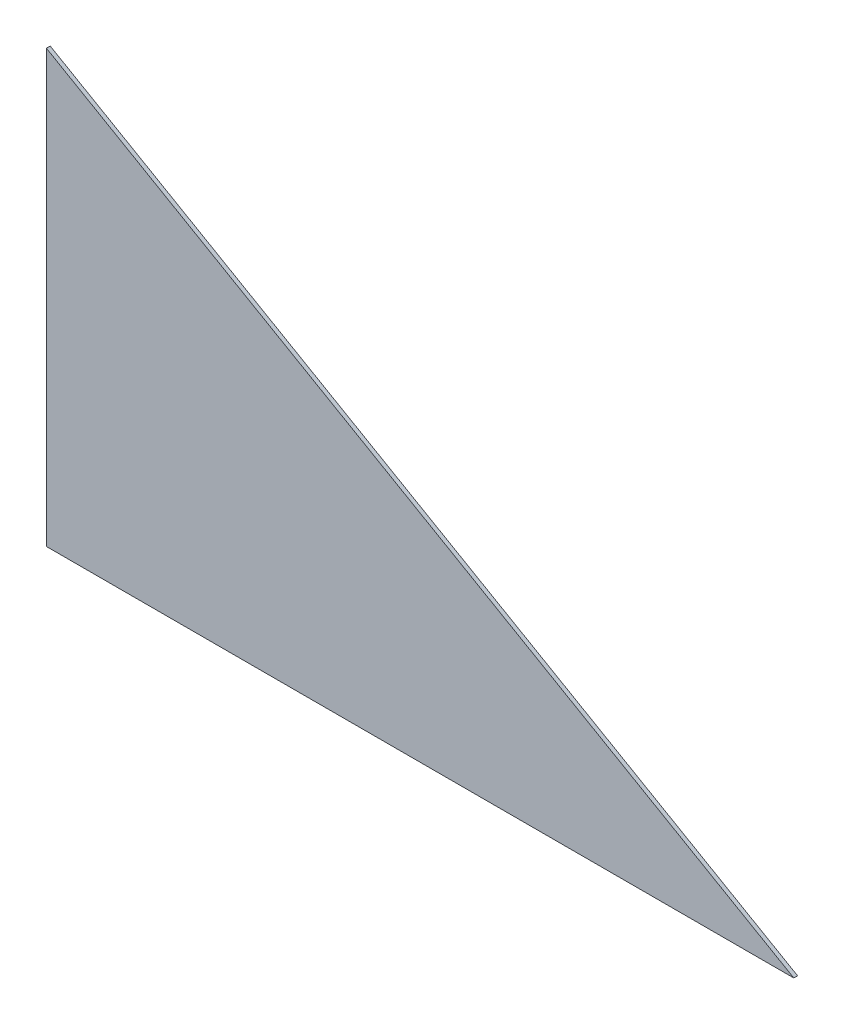
ISO-10303-21;
HEADER;
FILE_DESCRIPTION(('STEP AP214'),'2;1');
FILE_NAME('part.step','',(''),(''),'','','');
FILE_SCHEMA(('AUTOMOTIVE_DESIGN { 1 0 10303 214 1 1 1 1 }'));
ENDSEC;
DATA;
#1=APPLICATION_CONTEXT('core data for automotive mechanical design processes');
#2=APPLICATION_PROTOCOL_DEFINITION('international standard','automotive_design',2000,#1);
#3=PRODUCT_CONTEXT('',#1,'mechanical');
#4=PRODUCT('Part','Part','',(#3));
#5=PRODUCT_RELATED_PRODUCT_CATEGORY('part','',(#4));
#6=PRODUCT_DEFINITION_FORMATION('','',#4);
#7=PRODUCT_DEFINITION_CONTEXT('part definition',#1,'design');
#8=PRODUCT_DEFINITION('design','',#6,#7);
#9=PRODUCT_DEFINITION_SHAPE('','',#8);
#10=(LENGTH_UNIT() NAMED_UNIT(*) SI_UNIT(.MILLI.,.METRE.));
#11=(NAMED_UNIT(*) PLANE_ANGLE_UNIT() SI_UNIT($,.RADIAN.));
#12=(NAMED_UNIT(*) SI_UNIT($,.STERADIAN.) SOLID_ANGLE_UNIT());
#13=UNCERTAINTY_MEASURE_WITH_UNIT(LENGTH_MEASURE(1.E-05),#10,'distance_accuracy_value','');
#14=(GEOMETRIC_REPRESENTATION_CONTEXT(3) GLOBAL_UNCERTAINTY_ASSIGNED_CONTEXT((#13)) GLOBAL_UNIT_ASSIGNED_CONTEXT((#10,
#11,#12)) REPRESENTATION_CONTEXT('',''));
#15=CARTESIAN_POINT('',(0.,0.,0.));
#16=DIRECTION('',(0.,0.,1.));
#17=DIRECTION('',(1.,0.,0.));
#18=AXIS2_PLACEMENT_3D('',#15,#16,#17);
#19=CARTESIAN_POINT('',(250.,0.,1.27));
#20=DIRECTION('',(0.,1.,0.));
#21=DIRECTION('',(-1.,0.,0.));
#22=AXIS2_PLACEMENT_3D('',#19,#20,#21);
#23=PLANE('',#22);
#24=DIRECTION('',(1.,0.,0.));
#25=VECTOR('',#24,1.);
#26=CARTESIAN_POINT('',(250.,0.,0.));
#27=LINE('',#26,#25);
#28=CARTESIAN_POINT('',(0.,0.,0.));
#29=VERTEX_POINT('',#28);
#30=CARTESIAN_POINT('',(250.,0.,0.));
#31=VERTEX_POINT('',#30);
#32=EDGE_CURVE('E93',#29,#31,#27,.T.);
#33=ORIENTED_EDGE('',*,*,#32,.T.);
#34=DIRECTION('',(0.,0.,-1.));
#35=VECTOR('',#34,1.);
#36=CARTESIAN_POINT('',(250.,0.,1.27));
#37=LINE('',#36,#35);
#38=CARTESIAN_POINT('',(250.,0.,1.27));
#39=VERTEX_POINT('',#38);
#40=EDGE_CURVE('E11',#39,#31,#37,.T.);
#41=ORIENTED_EDGE('',*,*,#40,.F.);
#42=DIRECTION('',(1.,0.,0.));
#43=VECTOR('',#42,1.);
#44=CARTESIAN_POINT('',(250.,0.,1.27));
#45=LINE('',#44,#43);
#46=CARTESIAN_POINT('',(0.,0.,1.27));
#47=VERTEX_POINT('',#46);
#48=EDGE_CURVE('E86',#47,#39,#45,.T.);
#49=ORIENTED_EDGE('',*,*,#48,.F.);
#50=DIRECTION('',(0.,0.,-1.));
#51=VECTOR('',#50,1.);
#52=CARTESIAN_POINT('',(0.,0.,1.27));
#53=LINE('',#52,#51);
#54=EDGE_CURVE('E92',#47,#29,#53,.T.);
#55=ORIENTED_EDGE('',*,*,#54,.T.);
#56=EDGE_LOOP('',(#33,#41,#49,#55));
#57=FACE_BOUND('',#56,.T.);
#58=ADVANCED_FACE('F46',(#57),#23,.F.);
#59=CARTESIAN_POINT('',(0.,144.337567297408,1.27));
#60=DIRECTION('',(-0.500000000000004,-0.866025403784436,0.));
#61=DIRECTION('',(0.866025403784436,-0.500000000000004,0.));
#62=AXIS2_PLACEMENT_3D('',#59,#60,#61);
#63=PLANE('',#62);
#64=DIRECTION('',(-0.866025403784436,0.500000000000004,0.));
#65=VECTOR('',#64,1.);
#66=CARTESIAN_POINT('',(0.,144.337567297408,0.));
#67=LINE('',#66,#65);
#68=CARTESIAN_POINT('',(0.,144.337567297408,0.));
#69=VERTEX_POINT('',#68);
#70=EDGE_CURVE('E74',#31,#69,#67,.T.);
#71=ORIENTED_EDGE('',*,*,#70,.T.);
#72=DIRECTION('',(0.,0.,-1.));
#73=VECTOR('',#72,1.);
#74=CARTESIAN_POINT('',(0.,144.337567297408,1.27));
#75=LINE('',#74,#73);
#76=CARTESIAN_POINT('',(0.,144.337567297408,1.27));
#77=VERTEX_POINT('',#76);
#78=EDGE_CURVE('E53',#77,#69,#75,.T.);
#79=ORIENTED_EDGE('',*,*,#78,.F.);
#80=DIRECTION('',(-0.866025403784436,0.500000000000004,0.));
#81=VECTOR('',#80,1.);
#82=CARTESIAN_POINT('',(0.,144.337567297408,1.27));
#83=LINE('',#82,#81);
#84=EDGE_CURVE('E85',#39,#77,#83,.T.);
#85=ORIENTED_EDGE('',*,*,#84,.F.);
#86=ORIENTED_EDGE('',*,*,#40,.T.);
#87=EDGE_LOOP('',(#71,#79,#85,#86));
#88=FACE_BOUND('',#87,.T.);
#89=ADVANCED_FACE('F81',(#88),#63,.F.);
#90=CARTESIAN_POINT('',(0.,0.,1.27));
#91=DIRECTION('',(1.,0.,0.));
#92=DIRECTION('',(0.,0.,-1.));
#93=AXIS2_PLACEMENT_3D('',#90,#91,#92);
#94=PLANE('',#93);
#95=DIRECTION('',(0.,-1.,0.));
#96=VECTOR('',#95,1.);
#97=CARTESIAN_POINT('',(0.,0.,0.));
#98=LINE('',#97,#96);
#99=EDGE_CURVE('E80',#69,#29,#98,.T.);
#100=ORIENTED_EDGE('',*,*,#99,.T.);
#101=ORIENTED_EDGE('',*,*,#54,.F.);
#102=DIRECTION('',(0.,-1.,0.));
#103=VECTOR('',#102,1.);
#104=CARTESIAN_POINT('',(0.,0.,1.27));
#105=LINE('',#104,#103);
#106=EDGE_CURVE('E65',#77,#47,#105,.T.);
#107=ORIENTED_EDGE('',*,*,#106,.F.);
#108=ORIENTED_EDGE('',*,*,#78,.T.);
#109=EDGE_LOOP('',(#100,#101,#107,#108));
#110=FACE_BOUND('',#109,.T.);
#111=ADVANCED_FACE('F102',(#110),#94,.F.);
#112=CARTESIAN_POINT('',(0.,0.,1.27));
#113=DIRECTION('',(0.,0.,-1.));
#114=DIRECTION('',(-1.,0.,0.));
#115=AXIS2_PLACEMENT_3D('',#112,#113,#114);
#116=PLANE('',#115);
#117=ORIENTED_EDGE('',*,*,#48,.T.);
#118=ORIENTED_EDGE('',*,*,#84,.T.);
#119=ORIENTED_EDGE('',*,*,#106,.T.);
#120=EDGE_LOOP('',(#117,#118,#119));
#121=FACE_BOUND('',#120,.T.);
#122=ADVANCED_FACE('F87',(#121),#116,.F.);
#123=CARTESIAN_POINT('',(0.,0.,0.));
#124=DIRECTION('',(0.,0.,-1.));
#125=DIRECTION('',(-1.,0.,0.));
#126=AXIS2_PLACEMENT_3D('',#123,#124,#125);
#127=PLANE('',#126);
#128=ORIENTED_EDGE('',*,*,#32,.F.);
#129=ORIENTED_EDGE('',*,*,#99,.F.);
#130=ORIENTED_EDGE('',*,*,#70,.F.);
#131=EDGE_LOOP('',(#128,#129,#130));
#132=FACE_BOUND('',#131,.T.);
#133=ADVANCED_FACE('F105',(#132),#127,.T.);
#134=CLOSED_SHELL('',(#58,#89,#111,#122,#133));
#135=MANIFOLD_SOLID_BREP('B2',#134);
#136=ADVANCED_BREP_SHAPE_REPRESENTATION('',(#18,#135),#14);
#137=SHAPE_DEFINITION_REPRESENTATION(#9,#136);
ENDSEC;
END-ISO-10303-21;
